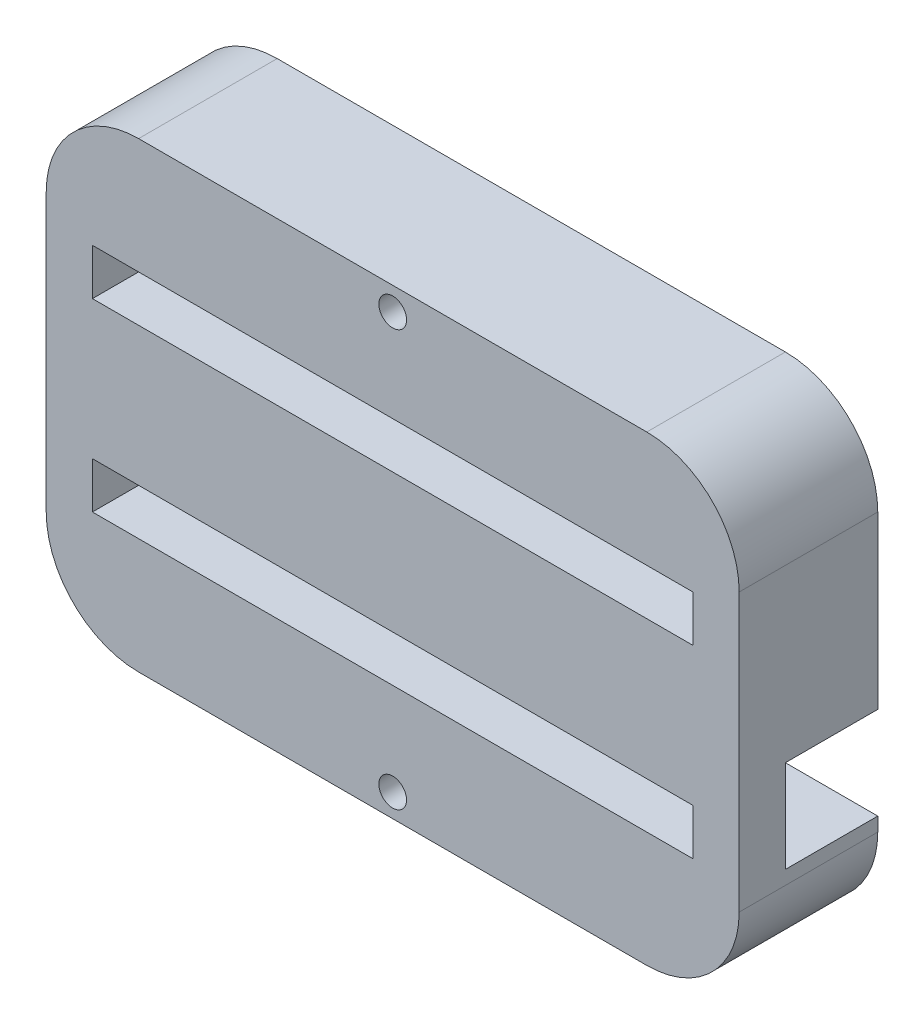
ISO-10303-21;
HEADER;
FILE_DESCRIPTION(('STEP AP214'),'2;1');
FILE_NAME('part.step','',(''),(''),'','','');
FILE_SCHEMA(('AUTOMOTIVE_DESIGN { 1 0 10303 214 1 1 1 1 }'));
ENDSEC;
DATA;
#1=APPLICATION_CONTEXT('core data for automotive mechanical design processes');
#2=APPLICATION_PROTOCOL_DEFINITION('international standard','automotive_design',2000,#1);
#3=PRODUCT_CONTEXT('',#1,'mechanical');
#4=PRODUCT('Part','Part','',(#3));
#5=PRODUCT_RELATED_PRODUCT_CATEGORY('part','',(#4));
#6=PRODUCT_DEFINITION_FORMATION('','',#4);
#7=PRODUCT_DEFINITION_CONTEXT('part definition',#1,'design');
#8=PRODUCT_DEFINITION('design','',#6,#7);
#9=PRODUCT_DEFINITION_SHAPE('','',#8);
#10=(LENGTH_UNIT() NAMED_UNIT(*) SI_UNIT(.MILLI.,.METRE.));
#11=(NAMED_UNIT(*) PLANE_ANGLE_UNIT() SI_UNIT($,.RADIAN.));
#12=(NAMED_UNIT(*) SI_UNIT($,.STERADIAN.) SOLID_ANGLE_UNIT());
#13=UNCERTAINTY_MEASURE_WITH_UNIT(LENGTH_MEASURE(1.E-05),#10,'distance_accuracy_value','');
#14=(GEOMETRIC_REPRESENTATION_CONTEXT(3) GLOBAL_UNCERTAINTY_ASSIGNED_CONTEXT((#13)) GLOBAL_UNIT_ASSIGNED_CONTEXT((#10,
#11,#12)) REPRESENTATION_CONTEXT('',''));
#15=CARTESIAN_POINT('',(0.,0.,0.));
#16=DIRECTION('',(0.,0.,1.));
#17=DIRECTION('',(1.,0.,0.));
#18=AXIS2_PLACEMENT_3D('',#15,#16,#17);
#19=CARTESIAN_POINT('',(89.142135623731,28.5,0.));
#20=DIRECTION('',(0.,-1.,0.));
#21=DIRECTION('',(0.,0.,-1.));
#22=AXIS2_PLACEMENT_3D('',#19,#20,#21);
#23=PLANE('',#22);
#24=DIRECTION('',(0.,0.,1.));
#25=VECTOR('',#24,1.);
#26=CARTESIAN_POINT('',(70.,28.5,-11.180339887499));
#27=LINE('',#26,#25);
#28=CARTESIAN_POINT('',(70.,28.5,0.));
#29=VERTEX_POINT('',#28);
#30=CARTESIAN_POINT('',(70.,28.5,10.));
#31=VERTEX_POINT('',#30);
#32=EDGE_CURVE('E64',#29,#31,#27,.T.);
#33=ORIENTED_EDGE('',*,*,#32,.F.);
#34=DIRECTION('',(-1.,0.,0.));
#35=VECTOR('',#34,1.);
#36=CARTESIAN_POINT('',(89.142135623731,28.5,0.));
#37=LINE('',#36,#35);
#38=CARTESIAN_POINT('',(55.,28.5,0.));
#39=VERTEX_POINT('',#38);
#40=EDGE_CURVE('E473',#29,#39,#37,.T.);
#41=ORIENTED_EDGE('',*,*,#40,.T.);
#42=DIRECTION('',(0.,0.,1.));
#43=VECTOR('',#42,1.);
#44=CARTESIAN_POINT('',(55.,28.5,0.));
#45=LINE('',#44,#43);
#46=CARTESIAN_POINT('',(55.,28.5,10.));
#47=VERTEX_POINT('',#46);
#48=EDGE_CURVE('E408',#39,#47,#45,.T.);
#49=ORIENTED_EDGE('',*,*,#48,.T.);
#50=DIRECTION('',(-1.,0.,0.));
#51=VECTOR('',#50,1.);
#52=CARTESIAN_POINT('',(89.142135623731,28.5,10.));
#53=LINE('',#52,#51);
#54=EDGE_CURVE('E471',#31,#47,#53,.T.);
#55=ORIENTED_EDGE('',*,*,#54,.F.);
#56=EDGE_LOOP('',(#33,#41,#49,#55));
#57=FACE_BOUND('',#56,.T.);
#58=ADVANCED_FACE('F49',(#57),#23,.F.);
#59=CARTESIAN_POINT('',(89.142135623731,11.5,0.));
#60=DIRECTION('',(0.,-1.,0.));
#61=DIRECTION('',(0.,0.,-1.));
#62=AXIS2_PLACEMENT_3D('',#59,#60,#61);
#63=PLANE('',#62);
#64=DIRECTION('',(0.,0.,1.));
#65=VECTOR('',#64,1.);
#66=CARTESIAN_POINT('',(5.,11.5,-11.180339887499));
#67=LINE('',#66,#65);
#68=CARTESIAN_POINT('',(5.,11.5,0.));
#69=VERTEX_POINT('',#68);
#70=CARTESIAN_POINT('',(5.,11.5,10.));
#71=VERTEX_POINT('',#70);
#72=EDGE_CURVE('E441',#69,#71,#67,.T.);
#73=ORIENTED_EDGE('',*,*,#72,.T.);
#74=DIRECTION('',(-1.,0.,0.));
#75=VECTOR('',#74,1.);
#76=CARTESIAN_POINT('',(89.142135623731,11.5,10.));
#77=LINE('',#76,#75);
#78=CARTESIAN_POINT('',(75.,11.5,10.));
#79=VERTEX_POINT('',#78);
#80=EDGE_CURVE('E271',#79,#71,#77,.T.);
#81=ORIENTED_EDGE('',*,*,#80,.F.);
#82=DIRECTION('',(0.,0.,-1.));
#83=VECTOR('',#82,1.);
#84=CARTESIAN_POINT('',(75.,11.5,0.));
#85=LINE('',#84,#83);
#86=CARTESIAN_POINT('',(75.,11.5,0.));
#87=VERTEX_POINT('',#86);
#88=EDGE_CURVE('E274',#79,#87,#85,.T.);
#89=ORIENTED_EDGE('',*,*,#88,.T.);
#90=DIRECTION('',(-1.,0.,0.));
#91=VECTOR('',#90,1.);
#92=CARTESIAN_POINT('',(89.142135623731,11.5,0.));
#93=LINE('',#92,#91);
#94=EDGE_CURVE('E72',#87,#69,#93,.T.);
#95=ORIENTED_EDGE('',*,*,#94,.T.);
#96=EDGE_LOOP('',(#73,#81,#89,#95));
#97=FACE_BOUND('',#96,.T.);
#98=ADVANCED_FACE('F525',(#97),#63,.F.);
#99=CARTESIAN_POINT('',(89.142135623731,21.5,0.));
#100=DIRECTION('',(0.,1.,0.));
#101=DIRECTION('',(0.,0.,1.));
#102=AXIS2_PLACEMENT_3D('',#99,#100,#101);
#103=PLANE('',#102);
#104=DIRECTION('',(0.,0.,1.));
#105=VECTOR('',#104,1.);
#106=CARTESIAN_POINT('',(5.,21.5,-11.180339887499));
#107=LINE('',#106,#105);
#108=CARTESIAN_POINT('',(5.,21.5,0.));
#109=VERTEX_POINT('',#108);
#110=CARTESIAN_POINT('',(5.,21.5,10.));
#111=VERTEX_POINT('',#110);
#112=EDGE_CURVE('E617',#109,#111,#107,.T.);
#113=ORIENTED_EDGE('',*,*,#112,.F.);
#114=DIRECTION('',(-1.,0.,0.));
#115=VECTOR('',#114,1.);
#116=CARTESIAN_POINT('',(89.142135623731,21.5,0.));
#117=LINE('',#116,#115);
#118=CARTESIAN_POINT('',(20.,21.5,0.));
#119=VERTEX_POINT('',#118);
#120=EDGE_CURVE('E253',#119,#109,#117,.T.);
#121=ORIENTED_EDGE('',*,*,#120,.F.);
#122=DIRECTION('',(0.,0.,1.));
#123=VECTOR('',#122,1.);
#124=CARTESIAN_POINT('',(20.,21.5,0.));
#125=LINE('',#124,#123);
#126=CARTESIAN_POINT('',(20.,21.5,10.));
#127=VERTEX_POINT('',#126);
#128=EDGE_CURVE('E237',#119,#127,#125,.T.);
#129=ORIENTED_EDGE('',*,*,#128,.T.);
#130=DIRECTION('',(-1.,0.,0.));
#131=VECTOR('',#130,1.);
#132=CARTESIAN_POINT('',(89.142135623731,21.5,10.));
#133=LINE('',#132,#131);
#134=EDGE_CURVE('E250',#127,#111,#133,.T.);
#135=ORIENTED_EDGE('',*,*,#134,.T.);
#136=EDGE_LOOP('',(#113,#121,#129,#135));
#137=FACE_BOUND('',#136,.T.);
#138=ADVANCED_FACE('F249',(#137),#103,.F.);
#139=CARTESIAN_POINT('',(89.142135623731,38.5,0.));
#140=DIRECTION('',(0.,1.,0.));
#141=DIRECTION('',(0.,0.,1.));
#142=AXIS2_PLACEMENT_3D('',#139,#140,#141);
#143=PLANE('',#142);
#144=DIRECTION('',(0.,0.,1.));
#145=VECTOR('',#144,1.);
#146=CARTESIAN_POINT('',(70.,38.5,-11.180339887499));
#147=LINE('',#146,#145);
#148=CARTESIAN_POINT('',(70.,38.5,0.));
#149=VERTEX_POINT('',#148);
#150=CARTESIAN_POINT('',(70.,38.5,10.));
#151=VERTEX_POINT('',#150);
#152=EDGE_CURVE('E415',#149,#151,#147,.T.);
#153=ORIENTED_EDGE('',*,*,#152,.T.);
#154=DIRECTION('',(-1.,0.,0.));
#155=VECTOR('',#154,1.);
#156=CARTESIAN_POINT('',(89.142135623731,38.5,10.));
#157=LINE('',#156,#155);
#158=CARTESIAN_POINT('',(0.,38.5,10.));
#159=VERTEX_POINT('',#158);
#160=EDGE_CURVE('E420',#151,#159,#157,.T.);
#161=ORIENTED_EDGE('',*,*,#160,.T.);
#162=DIRECTION('',(0.,0.,-1.));
#163=VECTOR('',#162,1.);
#164=CARTESIAN_POINT('',(0.,38.5,0.));
#165=LINE('',#164,#163);
#166=CARTESIAN_POINT('',(0.,38.5,0.));
#167=VERTEX_POINT('',#166);
#168=EDGE_CURVE('E465',#159,#167,#165,.T.);
#169=ORIENTED_EDGE('',*,*,#168,.T.);
#170=DIRECTION('',(-1.,0.,0.));
#171=VECTOR('',#170,1.);
#172=CARTESIAN_POINT('',(89.142135623731,38.5,0.));
#173=LINE('',#172,#171);
#174=EDGE_CURVE('E281',#149,#167,#173,.T.);
#175=ORIENTED_EDGE('',*,*,#174,.F.);
#176=EDGE_LOOP('',(#153,#161,#169,#175));
#177=FACE_BOUND('',#176,.T.);
#178=ADVANCED_FACE('F515',(#177),#143,.F.);
#179=CARTESIAN_POINT('',(89.142135623731,38.5,10.));
#180=DIRECTION('',(0.,0.,1.));
#181=DIRECTION('',(1.,0.,0.));
#182=AXIS2_PLACEMENT_3D('',#179,#180,#181);
#183=PLANE('',#182);
#184=CARTESIAN_POINT('',(37.5,25.,9.99999999999999));
#185=DIRECTION('',(0.,0.,-1.));
#186=DIRECTION('',(0.,1.,0.));
#187=AXIS2_PLACEMENT_3D('',#184,#185,#186);
#188=CIRCLE('',#187,1.7227980435016);
#189=CARTESIAN_POINT('',(37.5,26.7227980435016,9.99999999999999));
#190=VERTEX_POINT('',#189);
#191=EDGE_CURVE('E450',#190,#190,#188,.T.);
#192=ORIENTED_EDGE('',*,*,#191,.F.);
#193=EDGE_LOOP('',(#192));
#194=FACE_BOUND('',#193,.T.);
#195=DIRECTION('',(0.,-1.,0.));
#196=VECTOR('',#195,1.);
#197=CARTESIAN_POINT('',(5.,21.5,10.));
#198=LINE('',#197,#196);
#199=CARTESIAN_POINT('',(5.,17.5,10.));
#200=VERTEX_POINT('',#199);
#201=EDGE_CURVE('E258',#111,#200,#198,.T.);
#202=ORIENTED_EDGE('',*,*,#201,.F.);
#203=ORIENTED_EDGE('',*,*,#134,.F.);
#204=DIRECTION('',(0.,1.,0.));
#205=VECTOR('',#204,1.);
#206=CARTESIAN_POINT('',(20.,32.5,10.));
#207=LINE('',#206,#205);
#208=CARTESIAN_POINT('',(20.,28.5,10.));
#209=VERTEX_POINT('',#208);
#210=EDGE_CURVE('E234',#127,#209,#207,.T.);
#211=ORIENTED_EDGE('',*,*,#210,.T.);
#212=CARTESIAN_POINT('',(0.,28.5,10.));
#213=VERTEX_POINT('',#212);
#214=EDGE_CURVE('E472',#209,#213,#53,.T.);
#215=ORIENTED_EDGE('',*,*,#214,.T.);
#216=DIRECTION('',(0.,1.,0.));
#217=VECTOR('',#216,1.);
#218=CARTESIAN_POINT('',(0.,38.5,10.));
#219=LINE('',#218,#217);
#220=EDGE_CURVE('E463',#213,#159,#219,.T.);
#221=ORIENTED_EDGE('',*,*,#220,.T.);
#222=ORIENTED_EDGE('',*,*,#160,.F.);
#223=DIRECTION('',(0.,1.,0.));
#224=VECTOR('',#223,1.);
#225=CARTESIAN_POINT('',(70.,38.5,10.));
#226=LINE('',#225,#224);
#227=CARTESIAN_POINT('',(70.,37.5,10.));
#228=VERTEX_POINT('',#227);
#229=EDGE_CURVE('E57',#228,#151,#226,.T.);
#230=ORIENTED_EDGE('',*,*,#229,.F.);
#231=DIRECTION('',(-1.,0.,0.));
#232=VECTOR('',#231,1.);
#233=CARTESIAN_POINT('',(5.,37.5,10.));
#234=LINE('',#233,#232);
#235=CARTESIAN_POINT('',(5.,37.5,10.));
#236=VERTEX_POINT('',#235);
#237=EDGE_CURVE('E405',#228,#236,#234,.T.);
#238=ORIENTED_EDGE('',*,*,#237,.T.);
#239=DIRECTION('',(0.,-1.,0.));
#240=VECTOR('',#239,1.);
#241=CARTESIAN_POINT('',(5.,37.5,10.));
#242=LINE('',#241,#240);
#243=CARTESIAN_POINT('',(5.,32.5,10.));
#244=VERTEX_POINT('',#243);
#245=EDGE_CURVE('E285',#236,#244,#242,.T.);
#246=ORIENTED_EDGE('',*,*,#245,.T.);
#247=DIRECTION('',(1.,0.,0.));
#248=VECTOR('',#247,1.);
#249=CARTESIAN_POINT('',(5.,32.5,10.));
#250=LINE('',#249,#248);
#251=CARTESIAN_POINT('',(70.,32.5,10.));
#252=VERTEX_POINT('',#251);
#253=EDGE_CURVE('E283',#244,#252,#250,.T.);
#254=ORIENTED_EDGE('',*,*,#253,.T.);
#255=DIRECTION('',(0.,1.,0.));
#256=VECTOR('',#255,1.);
#257=CARTESIAN_POINT('',(70.,28.5,10.));
#258=LINE('',#257,#256);
#259=EDGE_CURVE('E439',#31,#252,#258,.T.);
#260=ORIENTED_EDGE('',*,*,#259,.F.);
#261=ORIENTED_EDGE('',*,*,#54,.T.);
#262=DIRECTION('',(0.,-1.,0.));
#263=VECTOR('',#262,1.);
#264=CARTESIAN_POINT('',(55.,32.5,10.));
#265=LINE('',#264,#263);
#266=CARTESIAN_POINT('',(55.,21.5,10.));
#267=VERTEX_POINT('',#266);
#268=EDGE_CURVE('E244',#47,#267,#265,.T.);
#269=ORIENTED_EDGE('',*,*,#268,.T.);
#270=CARTESIAN_POINT('',(75.,21.5,10.));
#271=VERTEX_POINT('',#270);
#272=EDGE_CURVE('E259',#271,#267,#133,.T.);
#273=ORIENTED_EDGE('',*,*,#272,.F.);
#274=DIRECTION('',(0.,-1.,0.));
#275=VECTOR('',#274,1.);
#276=CARTESIAN_POINT('',(75.,11.5,10.));
#277=LINE('',#276,#275);
#278=EDGE_CURVE('E275',#271,#79,#277,.T.);
#279=ORIENTED_EDGE('',*,*,#278,.T.);
#280=ORIENTED_EDGE('',*,*,#80,.T.);
#281=DIRECTION('',(0.,-1.,0.));
#282=VECTOR('',#281,1.);
#283=CARTESIAN_POINT('',(5.,38.5,10.));
#284=LINE('',#283,#282);
#285=CARTESIAN_POINT('',(5.,12.5,10.));
#286=VERTEX_POINT('',#285);
#287=EDGE_CURVE('E12',#286,#71,#284,.T.);
#288=ORIENTED_EDGE('',*,*,#287,.F.);
#289=DIRECTION('',(1.,0.,0.));
#290=VECTOR('',#289,1.);
#291=CARTESIAN_POINT('',(5.,12.5,10.));
#292=LINE('',#291,#290);
#293=CARTESIAN_POINT('',(70.,12.5,10.));
#294=VERTEX_POINT('',#293);
#295=EDGE_CURVE('E280',#286,#294,#292,.T.);
#296=ORIENTED_EDGE('',*,*,#295,.T.);
#297=DIRECTION('',(0.,1.,0.));
#298=VECTOR('',#297,1.);
#299=CARTESIAN_POINT('',(70.,17.5,10.));
#300=LINE('',#299,#298);
#301=CARTESIAN_POINT('',(70.,17.5,10.));
#302=VERTEX_POINT('',#301);
#303=EDGE_CURVE('E278',#294,#302,#300,.T.);
#304=ORIENTED_EDGE('',*,*,#303,.T.);
#305=DIRECTION('',(-1.,0.,0.));
#306=VECTOR('',#305,1.);
#307=CARTESIAN_POINT('',(5.,17.5,10.));
#308=LINE('',#307,#306);
#309=EDGE_CURVE('E403',#302,#200,#308,.T.);
#310=ORIENTED_EDGE('',*,*,#309,.T.);
#311=EDGE_LOOP('',(#202,#203,#211,#215,#221,#222,#230,#238,#246,#254,#260,#261,#269,#273,#279,
#280,#288,#296,#304,#310));
#312=FACE_BOUND('',#311,.T.);
#313=ADVANCED_FACE('F256',(#194,#312),#183,.F.);
#314=ORIENTED_EDGE('',*,*,#272,.T.);
#315=DIRECTION('',(0.,0.,-1.));
#316=VECTOR('',#315,1.);
#317=CARTESIAN_POINT('',(55.,21.5,0.));
#318=LINE('',#317,#316);
#319=CARTESIAN_POINT('',(55.,21.5,0.));
#320=VERTEX_POINT('',#319);
#321=EDGE_CURVE('E254',#267,#320,#318,.T.);
#322=ORIENTED_EDGE('',*,*,#321,.T.);
#323=CARTESIAN_POINT('',(75.,21.5,0.));
#324=VERTEX_POINT('',#323);
#325=EDGE_CURVE('E260',#324,#320,#117,.T.);
#326=ORIENTED_EDGE('',*,*,#325,.F.);
#327=DIRECTION('',(0.,0.,1.));
#328=VECTOR('',#327,1.);
#329=CARTESIAN_POINT('',(75.,21.5,0.));
#330=LINE('',#329,#328);
#331=EDGE_CURVE('E267',#324,#271,#330,.T.);
#332=ORIENTED_EDGE('',*,*,#331,.T.);
#333=EDGE_LOOP('',(#314,#322,#326,#332));
#334=FACE_BOUND('',#333,.T.);
#335=ADVANCED_FACE('F522',(#334),#103,.F.);
#336=CARTESIAN_POINT('',(65.,10.,0.));
#337=DIRECTION('',(0.,0.,1.));
#338=DIRECTION('',(1.,0.,0.));
#339=AXIS2_PLACEMENT_3D('',#336,#337,#338);
#340=PLANE('',#339);
#341=CARTESIAN_POINT('',(37.5,47.5,0.));
#342=DIRECTION('',(0.,0.,1.));
#343=DIRECTION('',(1.,0.,0.));
#344=AXIS2_PLACEMENT_3D('',#341,#342,#343);
#345=CIRCLE('',#344,1.5);
#346=CARTESIAN_POINT('',(39.,47.5,0.));
#347=VERTEX_POINT('',#346);
#348=EDGE_CURVE('E291',#347,#347,#345,.T.);
#349=ORIENTED_EDGE('',*,*,#348,.T.);
#350=EDGE_LOOP('',(#349));
#351=FACE_BOUND('',#350,.T.);
#352=CARTESIAN_POINT('',(65.,40.,0.));
#353=DIRECTION('',(0.,0.,1.));
#354=DIRECTION('',(-1.,0.,0.));
#355=AXIS2_PLACEMENT_3D('',#352,#353,#354);
#356=CIRCLE('',#355,9.99999999999999);
#357=CARTESIAN_POINT('',(75.,40.,0.));
#358=VERTEX_POINT('',#357);
#359=CARTESIAN_POINT('',(65.,50.,0.));
#360=VERTEX_POINT('',#359);
#361=EDGE_CURVE('E367',#358,#360,#356,.T.);
#362=ORIENTED_EDGE('',*,*,#361,.F.);
#363=DIRECTION('',(0.,1.,0.));
#364=VECTOR('',#363,1.);
#365=CARTESIAN_POINT('',(75.,10.,0.));
#366=LINE('',#365,#364);
#367=EDGE_CURVE('E363',#324,#358,#366,.T.);
#368=ORIENTED_EDGE('',*,*,#367,.F.);
#369=ORIENTED_EDGE('',*,*,#325,.T.);
#370=DIRECTION('',(0.,-1.,0.));
#371=VECTOR('',#370,1.);
#372=CARTESIAN_POINT('',(55.,32.5,0.));
#373=LINE('',#372,#371);
#374=EDGE_CURVE('E454',#39,#320,#373,.T.);
#375=ORIENTED_EDGE('',*,*,#374,.F.);
#376=ORIENTED_EDGE('',*,*,#40,.F.);
#377=DIRECTION('',(0.,-1.,0.));
#378=VECTOR('',#377,1.);
#379=CARTESIAN_POINT('',(70.,28.5,0.));
#380=LINE('',#379,#378);
#381=EDGE_CURVE('E513',#149,#29,#380,.T.);
#382=ORIENTED_EDGE('',*,*,#381,.F.);
#383=ORIENTED_EDGE('',*,*,#174,.T.);
#384=DIRECTION('',(0.,-1.,0.));
#385=VECTOR('',#384,1.);
#386=CARTESIAN_POINT('',(0.,10.0000000000001,0.));
#387=LINE('',#386,#385);
#388=CARTESIAN_POINT('',(0.,39.9999999999999,0.));
#389=VERTEX_POINT('',#388);
#390=EDGE_CURVE('E374',#389,#167,#387,.T.);
#391=ORIENTED_EDGE('',*,*,#390,.F.);
#392=CARTESIAN_POINT('',(10.,40.,0.));
#393=DIRECTION('',(0.,0.,1.));
#394=DIRECTION('',(-1.,0.,0.));
#395=AXIS2_PLACEMENT_3D('',#392,#393,#394);
#396=CIRCLE('',#395,10.);
#397=CARTESIAN_POINT('',(10.0000000000001,50.,0.));
#398=VERTEX_POINT('',#397);
#399=EDGE_CURVE('E371',#398,#389,#396,.T.);
#400=ORIENTED_EDGE('',*,*,#399,.F.);
#401=DIRECTION('',(-1.,0.,0.));
#402=VECTOR('',#401,1.);
#403=CARTESIAN_POINT('',(10.0000000000001,50.,0.));
#404=LINE('',#403,#402);
#405=EDGE_CURVE('E369',#360,#398,#404,.T.);
#406=ORIENTED_EDGE('',*,*,#405,.F.);
#407=EDGE_LOOP('',(#362,#368,#369,#375,#376,#382,#383,#391,#400,#406));
#408=FACE_BOUND('',#407,.T.);
#409=ADVANCED_FACE('F510',(#351,#408),#340,.F.);
#410=CARTESIAN_POINT('',(65.,10.,15.));
#411=DIRECTION('',(0.,0.,1.));
#412=DIRECTION('',(1.,0.,0.));
#413=AXIS2_PLACEMENT_3D('',#410,#411,#412);
#414=PLANE('',#413);
#415=CARTESIAN_POINT('',(37.5,47.5,15.));
#416=DIRECTION('',(0.,0.,1.));
#417=DIRECTION('',(1.,0.,0.));
#418=AXIS2_PLACEMENT_3D('',#415,#416,#417);
#419=CIRCLE('',#418,1.5);
#420=CARTESIAN_POINT('',(39.,47.5,15.));
#421=VERTEX_POINT('',#420);
#422=EDGE_CURVE('E294',#421,#421,#419,.T.);
#423=ORIENTED_EDGE('',*,*,#422,.F.);
#424=EDGE_LOOP('',(#423));
#425=FACE_BOUND('',#424,.T.);
#426=CARTESIAN_POINT('',(65.,10.,15.));
#427=DIRECTION('',(0.,0.,1.));
#428=DIRECTION('',(1.,0.,0.));
#429=AXIS2_PLACEMENT_3D('',#426,#427,#428);
#430=CIRCLE('',#429,10.);
#431=CARTESIAN_POINT('',(65.,0.,15.));
#432=VERTEX_POINT('',#431);
#433=CARTESIAN_POINT('',(75.,10.,15.));
#434=VERTEX_POINT('',#433);
#435=EDGE_CURVE('E342',#432,#434,#430,.T.);
#436=ORIENTED_EDGE('',*,*,#435,.T.);
#437=DIRECTION('',(0.,1.,0.));
#438=VECTOR('',#437,1.);
#439=CARTESIAN_POINT('',(75.,10.,15.));
#440=LINE('',#439,#438);
#441=CARTESIAN_POINT('',(75.,40.,15.));
#442=VERTEX_POINT('',#441);
#443=EDGE_CURVE('E345',#434,#442,#440,.T.);
#444=ORIENTED_EDGE('',*,*,#443,.T.);
#445=CARTESIAN_POINT('',(65.,40.,15.));
#446=DIRECTION('',(0.,0.,1.));
#447=DIRECTION('',(-1.,0.,0.));
#448=AXIS2_PLACEMENT_3D('',#445,#446,#447);
#449=CIRCLE('',#448,9.99999999999999);
#450=CARTESIAN_POINT('',(65.,50.,15.));
#451=VERTEX_POINT('',#450);
#452=EDGE_CURVE('E348',#442,#451,#449,.T.);
#453=ORIENTED_EDGE('',*,*,#452,.T.);
#454=DIRECTION('',(-1.,0.,0.));
#455=VECTOR('',#454,1.);
#456=CARTESIAN_POINT('',(10.0000000000001,50.,15.));
#457=LINE('',#456,#455);
#458=CARTESIAN_POINT('',(10.0000000000001,50.,15.));
#459=VERTEX_POINT('',#458);
#460=EDGE_CURVE('E350',#451,#459,#457,.T.);
#461=ORIENTED_EDGE('',*,*,#460,.T.);
#462=CARTESIAN_POINT('',(10.,40.,15.));
#463=DIRECTION('',(0.,0.,1.));
#464=DIRECTION('',(-1.,0.,0.));
#465=AXIS2_PLACEMENT_3D('',#462,#463,#464);
#466=CIRCLE('',#465,10.);
#467=CARTESIAN_POINT('',(0.,39.9999999999999,15.));
#468=VERTEX_POINT('',#467);
#469=EDGE_CURVE('E352',#459,#468,#466,.T.);
#470=ORIENTED_EDGE('',*,*,#469,.T.);
#471=DIRECTION('',(0.,-1.,0.));
#472=VECTOR('',#471,1.);
#473=CARTESIAN_POINT('',(0.,10.0000000000001,15.));
#474=LINE('',#473,#472);
#475=CARTESIAN_POINT('',(0.,10.,15.));
#476=VERTEX_POINT('',#475);
#477=EDGE_CURVE('E354',#468,#476,#474,.T.);
#478=ORIENTED_EDGE('',*,*,#477,.T.);
#479=CARTESIAN_POINT('',(10.,10.,15.));
#480=DIRECTION('',(0.,0.,1.));
#481=DIRECTION('',(-1.,0.,0.));
#482=AXIS2_PLACEMENT_3D('',#479,#480,#481);
#483=CIRCLE('',#482,10.);
#484=CARTESIAN_POINT('',(10.0000000000001,0.,15.));
#485=VERTEX_POINT('',#484);
#486=EDGE_CURVE('E356',#476,#485,#483,.T.);
#487=ORIENTED_EDGE('',*,*,#486,.T.);
#488=DIRECTION('',(1.,0.,0.));
#489=VECTOR('',#488,1.);
#490=CARTESIAN_POINT('',(10.0000000000001,0.,15.));
#491=LINE('',#490,#489);
#492=EDGE_CURVE('E358',#485,#432,#491,.T.);
#493=ORIENTED_EDGE('',*,*,#492,.T.);
#494=EDGE_LOOP('',(#436,#444,#453,#461,#470,#478,#487,#493));
#495=FACE_BOUND('',#494,.T.);
#496=DIRECTION('',(1.,0.,0.));
#497=VECTOR('',#496,1.);
#498=CARTESIAN_POINT('',(5.,32.5,15.));
#499=LINE('',#498,#497);
#500=CARTESIAN_POINT('',(5.,32.5,15.));
#501=VERTEX_POINT('',#500);
#502=CARTESIAN_POINT('',(70.,32.5,15.));
#503=VERTEX_POINT('',#502);
#504=EDGE_CURVE('E322',#501,#503,#499,.T.);
#505=ORIENTED_EDGE('',*,*,#504,.F.);
#506=DIRECTION('',(0.,-1.,0.));
#507=VECTOR('',#506,1.);
#508=CARTESIAN_POINT('',(5.,37.5,15.));
#509=LINE('',#508,#507);
#510=CARTESIAN_POINT('',(5.,37.5,15.));
#511=VERTEX_POINT('',#510);
#512=EDGE_CURVE('E320',#511,#501,#509,.T.);
#513=ORIENTED_EDGE('',*,*,#512,.F.);
#514=DIRECTION('',(-1.,0.,0.));
#515=VECTOR('',#514,1.);
#516=CARTESIAN_POINT('',(5.,37.5,15.));
#517=LINE('',#516,#515);
#518=CARTESIAN_POINT('',(70.,37.5,15.));
#519=VERTEX_POINT('',#518);
#520=EDGE_CURVE('E327',#519,#511,#517,.T.);
#521=ORIENTED_EDGE('',*,*,#520,.F.);
#522=DIRECTION('',(0.,1.,0.));
#523=VECTOR('',#522,1.);
#524=CARTESIAN_POINT('',(70.,37.5,15.));
#525=LINE('',#524,#523);
#526=EDGE_CURVE('E324',#503,#519,#525,.T.);
#527=ORIENTED_EDGE('',*,*,#526,.F.);
#528=EDGE_LOOP('',(#505,#513,#521,#527));
#529=FACE_BOUND('',#528,.T.);
#530=DIRECTION('',(1.,0.,0.));
#531=VECTOR('',#530,1.);
#532=CARTESIAN_POINT('',(5.,12.5,15.));
#533=LINE('',#532,#531);
#534=CARTESIAN_POINT('',(5.,12.5,15.));
#535=VERTEX_POINT('',#534);
#536=CARTESIAN_POINT('',(70.,12.5,15.));
#537=VERTEX_POINT('',#536);
#538=EDGE_CURVE('E301',#535,#537,#533,.T.);
#539=ORIENTED_EDGE('',*,*,#538,.F.);
#540=DIRECTION('',(0.,-1.,0.));
#541=VECTOR('',#540,1.);
#542=CARTESIAN_POINT('',(5.,17.5,15.));
#543=LINE('',#542,#541);
#544=CARTESIAN_POINT('',(5.,17.5,15.));
#545=VERTEX_POINT('',#544);
#546=EDGE_CURVE('E297',#545,#535,#543,.T.);
#547=ORIENTED_EDGE('',*,*,#546,.F.);
#548=DIRECTION('',(-1.,0.,0.));
#549=VECTOR('',#548,1.);
#550=CARTESIAN_POINT('',(5.,17.5,15.));
#551=LINE('',#550,#549);
#552=CARTESIAN_POINT('',(70.,17.5,15.));
#553=VERTEX_POINT('',#552);
#554=EDGE_CURVE('E306',#553,#545,#551,.T.);
#555=ORIENTED_EDGE('',*,*,#554,.F.);
#556=DIRECTION('',(0.,1.,0.));
#557=VECTOR('',#556,1.);
#558=CARTESIAN_POINT('',(70.,17.5,15.));
#559=LINE('',#558,#557);
#560=EDGE_CURVE('E303',#537,#553,#559,.T.);
#561=ORIENTED_EDGE('',*,*,#560,.F.);
#562=EDGE_LOOP('',(#539,#547,#555,#561));
#563=FACE_BOUND('',#562,.T.);
#564=CARTESIAN_POINT('',(37.5,2.5,15.));
#565=DIRECTION('',(0.,0.,1.));
#566=DIRECTION('',(1.,0.,0.));
#567=AXIS2_PLACEMENT_3D('',#564,#565,#566);
#568=CIRCLE('',#567,1.5);
#569=CARTESIAN_POINT('',(39.,2.5,15.));
#570=VERTEX_POINT('',#569);
#571=EDGE_CURVE('E288',#570,#570,#568,.T.);
#572=ORIENTED_EDGE('',*,*,#571,.F.);
#573=EDGE_LOOP('',(#572));
#574=FACE_BOUND('',#573,.T.);
#575=ADVANCED_FACE('F431',(#425,#495,#529,#563,#574),#414,.T.);
#576=CARTESIAN_POINT('',(20.,28.5,0.));
#577=VERTEX_POINT('',#576);
#578=CARTESIAN_POINT('',(0.,28.5,0.));
#579=VERTEX_POINT('',#578);
#580=EDGE_CURVE('E468',#577,#579,#37,.T.);
#581=ORIENTED_EDGE('',*,*,#580,.F.);
#582=DIRECTION('',(0.,1.,0.));
#583=VECTOR('',#582,1.);
#584=CARTESIAN_POINT('',(20.,32.5,0.));
#585=LINE('',#584,#583);
#586=EDGE_CURVE('E449',#119,#577,#585,.T.);
#587=ORIENTED_EDGE('',*,*,#586,.F.);
#588=ORIENTED_EDGE('',*,*,#120,.T.);
#589=DIRECTION('',(0.,1.,0.));
#590=VECTOR('',#589,1.);
#591=CARTESIAN_POINT('',(5.,21.5,0.));
#592=LINE('',#591,#590);
#593=EDGE_CURVE('E453',#69,#109,#592,.T.);
#594=ORIENTED_EDGE('',*,*,#593,.F.);
#595=ORIENTED_EDGE('',*,*,#94,.F.);
#596=CARTESIAN_POINT('',(75.,10.,0.));
#597=VERTEX_POINT('',#596);
#598=EDGE_CURVE('E364',#597,#87,#366,.T.);
#599=ORIENTED_EDGE('',*,*,#598,.F.);
#600=CARTESIAN_POINT('',(65.,10.,0.));
#601=DIRECTION('',(0.,0.,1.));
#602=DIRECTION('',(1.,0.,0.));
#603=AXIS2_PLACEMENT_3D('',#600,#601,#602);
#604=CIRCLE('',#603,10.);
#605=CARTESIAN_POINT('',(65.,0.,0.));
#606=VERTEX_POINT('',#605);
#607=EDGE_CURVE('E341',#606,#597,#604,.T.);
#608=ORIENTED_EDGE('',*,*,#607,.F.);
#609=DIRECTION('',(1.,0.,0.));
#610=VECTOR('',#609,1.);
#611=CARTESIAN_POINT('',(10.0000000000001,0.,0.));
#612=LINE('',#611,#610);
#613=CARTESIAN_POINT('',(10.0000000000001,0.,0.));
#614=VERTEX_POINT('',#613);
#615=EDGE_CURVE('E346',#614,#606,#612,.T.);
#616=ORIENTED_EDGE('',*,*,#615,.F.);
#617=CARTESIAN_POINT('',(10.,10.,0.));
#618=DIRECTION('',(0.,0.,1.));
#619=DIRECTION('',(-1.,0.,0.));
#620=AXIS2_PLACEMENT_3D('',#617,#618,#619);
#621=CIRCLE('',#620,10.);
#622=CARTESIAN_POINT('',(0.,10.,0.));
#623=VERTEX_POINT('',#622);
#624=EDGE_CURVE('E377',#623,#614,#621,.T.);
#625=ORIENTED_EDGE('',*,*,#624,.F.);
#626=EDGE_CURVE('E373',#579,#623,#387,.T.);
#627=ORIENTED_EDGE('',*,*,#626,.F.);
#628=EDGE_LOOP('',(#581,#587,#588,#594,#595,#599,#608,#616,#625,#627));
#629=FACE_BOUND('',#628,.T.);
#630=CARTESIAN_POINT('',(37.5,2.5,0.));
#631=DIRECTION('',(0.,0.,1.));
#632=DIRECTION('',(1.,0.,0.));
#633=AXIS2_PLACEMENT_3D('',#630,#631,#632);
#634=CIRCLE('',#633,1.5);
#635=CARTESIAN_POINT('',(39.,2.5,0.));
#636=VERTEX_POINT('',#635);
#637=EDGE_CURVE('E287',#636,#636,#634,.T.);
#638=ORIENTED_EDGE('',*,*,#637,.T.);
#639=EDGE_LOOP('',(#638));
#640=FACE_BOUND('',#639,.T.);
#641=ADVANCED_FACE('F487',(#629,#640),#340,.F.);
#642=CARTESIAN_POINT('',(65.,10.,15.));
#643=DIRECTION('',(0.,0.,-1.));
#644=DIRECTION('',(-1.,0.,0.));
#645=AXIS2_PLACEMENT_3D('',#642,#643,#644);
#646=CYLINDRICAL_SURFACE('',#645,10.);
#647=ORIENTED_EDGE('',*,*,#607,.T.);
#648=DIRECTION('',(0.,0.,-1.));
#649=VECTOR('',#648,1.);
#650=CARTESIAN_POINT('',(75.,10.,15.));
#651=LINE('',#650,#649);
#652=EDGE_CURVE('E400',#434,#597,#651,.T.);
#653=ORIENTED_EDGE('',*,*,#652,.F.);
#654=ORIENTED_EDGE('',*,*,#435,.F.);
#655=DIRECTION('',(0.,0.,-1.));
#656=VECTOR('',#655,1.);
#657=CARTESIAN_POINT('',(65.,0.,15.));
#658=LINE('',#657,#656);
#659=EDGE_CURVE('E360',#432,#606,#658,.T.);
#660=ORIENTED_EDGE('',*,*,#659,.T.);
#661=EDGE_LOOP('',(#647,#653,#654,#660));
#662=FACE_BOUND('',#661,.T.);
#663=ADVANCED_FACE('F51',(#662),#646,.T.);
#664=CARTESIAN_POINT('',(75.,10.,15.));
#665=DIRECTION('',(-1.,0.,0.));
#666=DIRECTION('',(0.,0.,1.));
#667=AXIS2_PLACEMENT_3D('',#664,#665,#666);
#668=PLANE('',#667);
#669=ORIENTED_EDGE('',*,*,#367,.T.);
#670=DIRECTION('',(0.,0.,-1.));
#671=VECTOR('',#670,1.);
#672=CARTESIAN_POINT('',(75.,40.,15.));
#673=LINE('',#672,#671);
#674=EDGE_CURVE('E397',#442,#358,#673,.T.);
#675=ORIENTED_EDGE('',*,*,#674,.F.);
#676=ORIENTED_EDGE('',*,*,#443,.F.);
#677=ORIENTED_EDGE('',*,*,#652,.T.);
#678=ORIENTED_EDGE('',*,*,#598,.T.);
#679=ORIENTED_EDGE('',*,*,#88,.F.);
#680=ORIENTED_EDGE('',*,*,#278,.F.);
#681=ORIENTED_EDGE('',*,*,#331,.F.);
#682=EDGE_LOOP('',(#669,#675,#676,#677,#678,#679,#680,#681));
#683=FACE_BOUND('',#682,.T.);
#684=ADVANCED_FACE('F598',(#683),#668,.F.);
#685=CARTESIAN_POINT('',(65.,40.,15.));
#686=DIRECTION('',(0.,0.,-1.));
#687=DIRECTION('',(-1.,0.,0.));
#688=AXIS2_PLACEMENT_3D('',#685,#686,#687);
#689=CYLINDRICAL_SURFACE('',#688,9.99999999999999);
#690=ORIENTED_EDGE('',*,*,#361,.T.);
#691=DIRECTION('',(0.,0.,-1.));
#692=VECTOR('',#691,1.);
#693=CARTESIAN_POINT('',(65.,50.,15.));
#694=LINE('',#693,#692);
#695=EDGE_CURVE('E394',#451,#360,#694,.T.);
#696=ORIENTED_EDGE('',*,*,#695,.F.);
#697=ORIENTED_EDGE('',*,*,#452,.F.);
#698=ORIENTED_EDGE('',*,*,#674,.T.);
#699=EDGE_LOOP('',(#690,#696,#697,#698));
#700=FACE_BOUND('',#699,.T.);
#701=ADVANCED_FACE('F595',(#700),#689,.T.);
#702=CARTESIAN_POINT('',(10.0000000000001,50.,15.));
#703=DIRECTION('',(0.,-1.,0.));
#704=DIRECTION('',(1.,0.,0.));
#705=AXIS2_PLACEMENT_3D('',#702,#703,#704);
#706=PLANE('',#705);
#707=ORIENTED_EDGE('',*,*,#405,.T.);
#708=DIRECTION('',(0.,0.,-1.));
#709=VECTOR('',#708,1.);
#710=CARTESIAN_POINT('',(10.0000000000001,50.,15.));
#711=LINE('',#710,#709);
#712=EDGE_CURVE('E391',#459,#398,#711,.T.);
#713=ORIENTED_EDGE('',*,*,#712,.F.);
#714=ORIENTED_EDGE('',*,*,#460,.F.);
#715=ORIENTED_EDGE('',*,*,#695,.T.);
#716=EDGE_LOOP('',(#707,#713,#714,#715));
#717=FACE_BOUND('',#716,.T.);
#718=ADVANCED_FACE('F592',(#717),#706,.F.);
#719=CARTESIAN_POINT('',(10.,40.,15.));
#720=DIRECTION('',(0.,0.,-1.));
#721=DIRECTION('',(-1.,0.,0.));
#722=AXIS2_PLACEMENT_3D('',#719,#720,#721);
#723=CYLINDRICAL_SURFACE('',#722,10.);
#724=ORIENTED_EDGE('',*,*,#399,.T.);
#725=DIRECTION('',(0.,0.,-1.));
#726=VECTOR('',#725,1.);
#727=CARTESIAN_POINT('',(0.,39.9999999999999,15.));
#728=LINE('',#727,#726);
#729=EDGE_CURVE('E388',#468,#389,#728,.T.);
#730=ORIENTED_EDGE('',*,*,#729,.F.);
#731=ORIENTED_EDGE('',*,*,#469,.F.);
#732=ORIENTED_EDGE('',*,*,#712,.T.);
#733=EDGE_LOOP('',(#724,#730,#731,#732));
#734=FACE_BOUND('',#733,.T.);
#735=ADVANCED_FACE('F589',(#734),#723,.T.);
#736=CARTESIAN_POINT('',(0.,10.0000000000001,15.));
#737=DIRECTION('',(1.,0.,0.));
#738=DIRECTION('',(0.,0.,-1.));
#739=AXIS2_PLACEMENT_3D('',#736,#737,#738);
#740=PLANE('',#739);
#741=ORIENTED_EDGE('',*,*,#626,.T.);
#742=DIRECTION('',(0.,0.,-1.));
#743=VECTOR('',#742,1.);
#744=CARTESIAN_POINT('',(0.,10.,15.));
#745=LINE('',#744,#743);
#746=EDGE_CURVE('E385',#476,#623,#745,.T.);
#747=ORIENTED_EDGE('',*,*,#746,.F.);
#748=ORIENTED_EDGE('',*,*,#477,.F.);
#749=ORIENTED_EDGE('',*,*,#729,.T.);
#750=ORIENTED_EDGE('',*,*,#390,.T.);
#751=ORIENTED_EDGE('',*,*,#168,.F.);
#752=ORIENTED_EDGE('',*,*,#220,.F.);
#753=DIRECTION('',(0.,0.,1.));
#754=VECTOR('',#753,1.);
#755=CARTESIAN_POINT('',(0.,28.5,0.));
#756=LINE('',#755,#754);
#757=EDGE_CURVE('E263',#579,#213,#756,.T.);
#758=ORIENTED_EDGE('',*,*,#757,.F.);
#759=EDGE_LOOP('',(#741,#747,#748,#749,#750,#751,#752,#758));
#760=FACE_BOUND('',#759,.T.);
#761=ADVANCED_FACE('F483',(#760),#740,.F.);
#762=CARTESIAN_POINT('',(10.,10.,15.));
#763=DIRECTION('',(0.,0.,-1.));
#764=DIRECTION('',(-1.,0.,0.));
#765=AXIS2_PLACEMENT_3D('',#762,#763,#764);
#766=CYLINDRICAL_SURFACE('',#765,10.);
#767=ORIENTED_EDGE('',*,*,#624,.T.);
#768=DIRECTION('',(0.,0.,-1.));
#769=VECTOR('',#768,1.);
#770=CARTESIAN_POINT('',(10.0000000000001,0.,15.));
#771=LINE('',#770,#769);
#772=EDGE_CURVE('E382',#485,#614,#771,.T.);
#773=ORIENTED_EDGE('',*,*,#772,.F.);
#774=ORIENTED_EDGE('',*,*,#486,.F.);
#775=ORIENTED_EDGE('',*,*,#746,.T.);
#776=EDGE_LOOP('',(#767,#773,#774,#775));
#777=FACE_BOUND('',#776,.T.);
#778=ADVANCED_FACE('F493',(#777),#766,.T.);
#779=CARTESIAN_POINT('',(10.0000000000001,0.,15.));
#780=DIRECTION('',(0.,1.,0.));
#781=DIRECTION('',(0.,0.,1.));
#782=AXIS2_PLACEMENT_3D('',#779,#780,#781);
#783=PLANE('',#782);
#784=ORIENTED_EDGE('',*,*,#615,.T.);
#785=ORIENTED_EDGE('',*,*,#659,.F.);
#786=ORIENTED_EDGE('',*,*,#492,.F.);
#787=ORIENTED_EDGE('',*,*,#772,.T.);
#788=EDGE_LOOP('',(#784,#785,#786,#787));
#789=FACE_BOUND('',#788,.T.);
#790=ADVANCED_FACE('F497',(#789),#783,.F.);
#791=CARTESIAN_POINT('',(5.,37.5,15.));
#792=DIRECTION('',(1.,0.,0.));
#793=DIRECTION('',(0.,0.,-1.));
#794=AXIS2_PLACEMENT_3D('',#791,#792,#793);
#795=PLANE('',#794);
#796=ORIENTED_EDGE('',*,*,#245,.F.);
#797=DIRECTION('',(0.,0.,-1.));
#798=VECTOR('',#797,1.);
#799=CARTESIAN_POINT('',(5.,37.5,15.));
#800=LINE('',#799,#798);
#801=EDGE_CURVE('E329',#511,#236,#800,.T.);
#802=ORIENTED_EDGE('',*,*,#801,.F.);
#803=ORIENTED_EDGE('',*,*,#512,.T.);
#804=DIRECTION('',(0.,0.,-1.));
#805=VECTOR('',#804,1.);
#806=CARTESIAN_POINT('',(5.,32.5,15.));
#807=LINE('',#806,#805);
#808=EDGE_CURVE('E338',#501,#244,#807,.T.);
#809=ORIENTED_EDGE('',*,*,#808,.T.);
#810=EDGE_LOOP('',(#796,#802,#803,#809));
#811=FACE_BOUND('',#810,.T.);
#812=ADVANCED_FACE('F427',(#811),#795,.T.);
#813=CARTESIAN_POINT('',(5.,32.5,15.));
#814=DIRECTION('',(0.,1.,0.));
#815=DIRECTION('',(0.,0.,1.));
#816=AXIS2_PLACEMENT_3D('',#813,#814,#815);
#817=PLANE('',#816);
#818=ORIENTED_EDGE('',*,*,#253,.F.);
#819=ORIENTED_EDGE('',*,*,#808,.F.);
#820=ORIENTED_EDGE('',*,*,#504,.T.);
#821=DIRECTION('',(0.,0.,-1.));
#822=VECTOR('',#821,1.);
#823=CARTESIAN_POINT('',(70.,32.5,15.));
#824=LINE('',#823,#822);
#825=EDGE_CURVE('E335',#503,#252,#824,.T.);
#826=ORIENTED_EDGE('',*,*,#825,.T.);
#827=EDGE_LOOP('',(#818,#819,#820,#826));
#828=FACE_BOUND('',#827,.T.);
#829=ADVANCED_FACE('F437',(#828),#817,.T.);
#830=CARTESIAN_POINT('',(70.,37.5,15.));
#831=DIRECTION('',(-1.,0.,0.));
#832=DIRECTION('',(0.,0.,1.));
#833=AXIS2_PLACEMENT_3D('',#830,#831,#832);
#834=PLANE('',#833);
#835=DIRECTION('',(0.,0.,-1.));
#836=VECTOR('',#835,1.);
#837=CARTESIAN_POINT('',(70.,37.5,15.));
#838=LINE('',#837,#836);
#839=EDGE_CURVE('E332',#519,#228,#838,.T.);
#840=ORIENTED_EDGE('',*,*,#839,.T.);
#841=ORIENTED_EDGE('',*,*,#229,.T.);
#842=ORIENTED_EDGE('',*,*,#152,.F.);
#843=ORIENTED_EDGE('',*,*,#381,.T.);
#844=ORIENTED_EDGE('',*,*,#32,.T.);
#845=ORIENTED_EDGE('',*,*,#259,.T.);
#846=ORIENTED_EDGE('',*,*,#825,.F.);
#847=ORIENTED_EDGE('',*,*,#526,.T.);
#848=EDGE_LOOP('',(#840,#841,#842,#843,#844,#845,#846,#847));
#849=FACE_BOUND('',#848,.T.);
#850=ADVANCED_FACE('F413',(#849),#834,.T.);
#851=CARTESIAN_POINT('',(5.,37.5,15.));
#852=DIRECTION('',(0.,-1.,0.));
#853=DIRECTION('',(0.,0.,-1.));
#854=AXIS2_PLACEMENT_3D('',#851,#852,#853);
#855=PLANE('',#854);
#856=ORIENTED_EDGE('',*,*,#237,.F.);
#857=ORIENTED_EDGE('',*,*,#839,.F.);
#858=ORIENTED_EDGE('',*,*,#520,.T.);
#859=ORIENTED_EDGE('',*,*,#801,.T.);
#860=EDGE_LOOP('',(#856,#857,#858,#859));
#861=FACE_BOUND('',#860,.T.);
#862=ADVANCED_FACE('F422',(#861),#855,.T.);
#863=CARTESIAN_POINT('',(5.,17.5,15.));
#864=DIRECTION('',(1.,0.,0.));
#865=DIRECTION('',(0.,0.,-1.));
#866=AXIS2_PLACEMENT_3D('',#863,#864,#865);
#867=PLANE('',#866);
#868=DIRECTION('',(0.,0.,-1.));
#869=VECTOR('',#868,1.);
#870=CARTESIAN_POINT('',(5.,12.5,15.));
#871=LINE('',#870,#869);
#872=EDGE_CURVE('E317',#535,#286,#871,.T.);
#873=ORIENTED_EDGE('',*,*,#872,.T.);
#874=ORIENTED_EDGE('',*,*,#287,.T.);
#875=ORIENTED_EDGE('',*,*,#72,.F.);
#876=ORIENTED_EDGE('',*,*,#593,.T.);
#877=ORIENTED_EDGE('',*,*,#112,.T.);
#878=ORIENTED_EDGE('',*,*,#201,.T.);
#879=DIRECTION('',(0.,0.,-1.));
#880=VECTOR('',#879,1.);
#881=CARTESIAN_POINT('',(5.,17.5,15.));
#882=LINE('',#881,#880);
#883=EDGE_CURVE('E308',#545,#200,#882,.T.);
#884=ORIENTED_EDGE('',*,*,#883,.F.);
#885=ORIENTED_EDGE('',*,*,#546,.T.);
#886=EDGE_LOOP('',(#873,#874,#875,#876,#877,#878,#884,#885));
#887=FACE_BOUND('',#886,.T.);
#888=ADVANCED_FACE('F566',(#887),#867,.T.);
#889=CARTESIAN_POINT('',(5.,12.5,15.));
#890=DIRECTION('',(0.,1.,0.));
#891=DIRECTION('',(0.,0.,1.));
#892=AXIS2_PLACEMENT_3D('',#889,#890,#891);
#893=PLANE('',#892);
#894=ORIENTED_EDGE('',*,*,#295,.F.);
#895=ORIENTED_EDGE('',*,*,#872,.F.);
#896=ORIENTED_EDGE('',*,*,#538,.T.);
#897=DIRECTION('',(0.,0.,-1.));
#898=VECTOR('',#897,1.);
#899=CARTESIAN_POINT('',(70.,12.5,15.));
#900=LINE('',#899,#898);
#901=EDGE_CURVE('E314',#537,#294,#900,.T.);
#902=ORIENTED_EDGE('',*,*,#901,.T.);
#903=EDGE_LOOP('',(#894,#895,#896,#902));
#904=FACE_BOUND('',#903,.T.);
#905=ADVANCED_FACE('F562',(#904),#893,.T.);
#906=CARTESIAN_POINT('',(70.,17.5,15.));
#907=DIRECTION('',(-1.,0.,0.));
#908=DIRECTION('',(0.,0.,1.));
#909=AXIS2_PLACEMENT_3D('',#906,#907,#908);
#910=PLANE('',#909);
#911=ORIENTED_EDGE('',*,*,#303,.F.);
#912=ORIENTED_EDGE('',*,*,#901,.F.);
#913=ORIENTED_EDGE('',*,*,#560,.T.);
#914=DIRECTION('',(0.,0.,-1.));
#915=VECTOR('',#914,1.);
#916=CARTESIAN_POINT('',(70.,17.5,15.));
#917=LINE('',#916,#915);
#918=EDGE_CURVE('E311',#553,#302,#917,.T.);
#919=ORIENTED_EDGE('',*,*,#918,.T.);
#920=EDGE_LOOP('',(#911,#912,#913,#919));
#921=FACE_BOUND('',#920,.T.);
#922=ADVANCED_FACE('F558',(#921),#910,.T.);
#923=CARTESIAN_POINT('',(5.,17.5,15.));
#924=DIRECTION('',(0.,-1.,0.));
#925=DIRECTION('',(0.,0.,-1.));
#926=AXIS2_PLACEMENT_3D('',#923,#924,#925);
#927=PLANE('',#926);
#928=ORIENTED_EDGE('',*,*,#309,.F.);
#929=ORIENTED_EDGE('',*,*,#918,.F.);
#930=ORIENTED_EDGE('',*,*,#554,.T.);
#931=ORIENTED_EDGE('',*,*,#883,.T.);
#932=EDGE_LOOP('',(#928,#929,#930,#931));
#933=FACE_BOUND('',#932,.T.);
#934=ADVANCED_FACE('F551',(#933),#927,.T.);
#935=CARTESIAN_POINT('',(37.5,47.5,15.));
#936=DIRECTION('',(0.,0.,-1.));
#937=DIRECTION('',(-1.,0.,0.));
#938=AXIS2_PLACEMENT_3D('',#935,#936,#937);
#939=CYLINDRICAL_SURFACE('',#938,1.5);
#940=ORIENTED_EDGE('',*,*,#422,.T.);
#941=EDGE_LOOP('',(#940));
#942=FACE_BOUND('',#941,.T.);
#943=ORIENTED_EDGE('',*,*,#348,.F.);
#944=EDGE_LOOP('',(#943));
#945=FACE_BOUND('',#944,.T.);
#946=ADVANCED_FACE('F544',(#942,#945),#939,.F.);
#947=CARTESIAN_POINT('',(37.5,2.5,15.));
#948=DIRECTION('',(0.,0.,-1.));
#949=DIRECTION('',(-1.,0.,0.));
#950=AXIS2_PLACEMENT_3D('',#947,#948,#949);
#951=CYLINDRICAL_SURFACE('',#950,1.5);
#952=ORIENTED_EDGE('',*,*,#571,.T.);
#953=EDGE_LOOP('',(#952));
#954=FACE_BOUND('',#953,.T.);
#955=ORIENTED_EDGE('',*,*,#637,.F.);
#956=EDGE_LOOP('',(#955));
#957=FACE_BOUND('',#956,.T.);
#958=ADVANCED_FACE('F537',(#954,#957),#951,.F.);
#959=ORIENTED_EDGE('',*,*,#214,.F.);
#960=DIRECTION('',(0.,0.,-1.));
#961=VECTOR('',#960,1.);
#962=CARTESIAN_POINT('',(20.,28.5,0.));
#963=LINE('',#962,#961);
#964=EDGE_CURVE('E240',#209,#577,#963,.T.);
#965=ORIENTED_EDGE('',*,*,#964,.T.);
#966=ORIENTED_EDGE('',*,*,#580,.T.);
#967=ORIENTED_EDGE('',*,*,#757,.T.);
#968=EDGE_LOOP('',(#959,#965,#966,#967));
#969=FACE_BOUND('',#968,.T.);
#970=ADVANCED_FACE('F478',(#969),#23,.F.);
#971=CARTESIAN_POINT('',(55.,32.5,48.0788655293195));
#972=DIRECTION('',(1.,0.,0.));
#973=DIRECTION('',(0.,0.,-1.));
#974=AXIS2_PLACEMENT_3D('',#971,#972,#973);
#975=PLANE('',#974);
#976=ORIENTED_EDGE('',*,*,#268,.F.);
#977=ORIENTED_EDGE('',*,*,#48,.F.);
#978=ORIENTED_EDGE('',*,*,#374,.T.);
#979=ORIENTED_EDGE('',*,*,#321,.F.);
#980=EDGE_LOOP('',(#976,#977,#978,#979));
#981=FACE_BOUND('',#980,.T.);
#982=ADVANCED_FACE('F536',(#981),#975,.F.);
#983=CARTESIAN_POINT('',(20.,32.5,48.0788655293195));
#984=DIRECTION('',(-1.,0.,0.));
#985=DIRECTION('',(0.,-1.,0.));
#986=AXIS2_PLACEMENT_3D('',#983,#984,#985);
#987=PLANE('',#986);
#988=ORIENTED_EDGE('',*,*,#586,.T.);
#989=ORIENTED_EDGE('',*,*,#964,.F.);
#990=ORIENTED_EDGE('',*,*,#210,.F.);
#991=ORIENTED_EDGE('',*,*,#128,.F.);
#992=EDGE_LOOP('',(#988,#989,#990,#991));
#993=FACE_BOUND('',#992,.T.);
#994=ADVANCED_FACE('F236',(#993),#987,.F.);
#995=CARTESIAN_POINT('',(37.5,25.,10.5));
#996=DIRECTION('',(0.,0.,-1.));
#997=DIRECTION('',(0.,1.,0.));
#998=AXIS2_PLACEMENT_3D('',#995,#996,#997);
#999=CYLINDRICAL_SURFACE('',#998,1.7227980435016);
#1000=CARTESIAN_POINT('',(37.5,25.,10.5));
#1001=DIRECTION('',(0.,0.,-1.));
#1002=DIRECTION('',(0.,1.,0.));
#1003=AXIS2_PLACEMENT_3D('',#1000,#1001,#1002);
#1004=CIRCLE('',#1003,1.7227980435016);
#1005=CARTESIAN_POINT('',(37.5,26.7227980435016,10.5));
#1006=VERTEX_POINT('',#1005);
#1007=EDGE_CURVE('E446',#1006,#1006,#1004,.T.);
#1008=ORIENTED_EDGE('',*,*,#1007,.F.);
#1009=EDGE_LOOP('',(#1008));
#1010=FACE_BOUND('',#1009,.T.);
#1011=ORIENTED_EDGE('',*,*,#191,.T.);
#1012=EDGE_LOOP('',(#1011));
#1013=FACE_BOUND('',#1012,.T.);
#1014=ADVANCED_FACE('F746',(#1010,#1013),#999,.F.);
#1015=CARTESIAN_POINT('',(37.5,25.,10.5));
#1016=DIRECTION('',(0.,0.,-1.));
#1017=DIRECTION('',(0.,1.,0.));
#1018=AXIS2_PLACEMENT_3D('',#1015,#1016,#1017);
#1019=PLANE('',#1018);
#1020=ORIENTED_EDGE('',*,*,#1007,.T.);
#1021=EDGE_LOOP('',(#1020));
#1022=FACE_BOUND('',#1021,.T.);
#1023=ADVANCED_FACE('F755',(#1022),#1019,.T.);
#1024=CLOSED_SHELL('',(#58,#98,#138,#178,#313,#335,#409,#575,#641,#663,#684,#701,#718,#735,#761,
#778,#790,#812,#829,#850,#862,#888,#905,#922,#934,#946,#958,#970,#982,#994,#1014,#1023));
#1025=MANIFOLD_SOLID_BREP('B2',#1024);
#1026=ADVANCED_BREP_SHAPE_REPRESENTATION('',(#18,#1025),#14);
#1027=SHAPE_DEFINITION_REPRESENTATION(#9,#1026);
ENDSEC;
END-ISO-10303-21;
